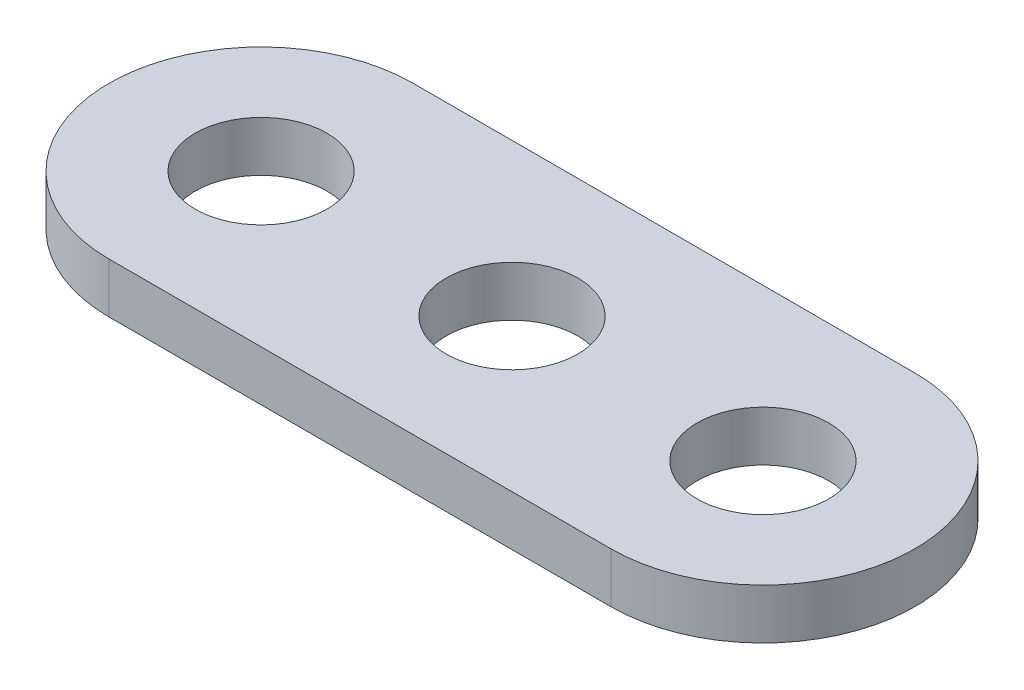
ISO-10303-21;
HEADER;
FILE_DESCRIPTION(('STEP AP214'),'2;1');
FILE_NAME('part.step','',(''),(''),'','','');
FILE_SCHEMA(('AUTOMOTIVE_DESIGN { 1 0 10303 214 1 1 1 1 }'));
ENDSEC;
DATA;
#1=APPLICATION_CONTEXT('core data for automotive mechanical design processes');
#2=APPLICATION_PROTOCOL_DEFINITION('international standard','automotive_design',2000,#1);
#3=PRODUCT_CONTEXT('',#1,'mechanical');
#4=PRODUCT('Part','Part','',(#3));
#5=PRODUCT_RELATED_PRODUCT_CATEGORY('part','',(#4));
#6=PRODUCT_DEFINITION_FORMATION('','',#4);
#7=PRODUCT_DEFINITION_CONTEXT('part definition',#1,'design');
#8=PRODUCT_DEFINITION('design','',#6,#7);
#9=PRODUCT_DEFINITION_SHAPE('','',#8);
#10=(LENGTH_UNIT() NAMED_UNIT(*) SI_UNIT(.MILLI.,.METRE.));
#11=(NAMED_UNIT(*) PLANE_ANGLE_UNIT() SI_UNIT($,.RADIAN.));
#12=(NAMED_UNIT(*) SI_UNIT($,.STERADIAN.) SOLID_ANGLE_UNIT());
#13=UNCERTAINTY_MEASURE_WITH_UNIT(LENGTH_MEASURE(1.E-05),#10,'distance_accuracy_value','');
#14=(GEOMETRIC_REPRESENTATION_CONTEXT(3) GLOBAL_UNCERTAINTY_ASSIGNED_CONTEXT((#13)) GLOBAL_UNIT_ASSIGNED_CONTEXT((#10,
#11,#12)) REPRESENTATION_CONTEXT('',''));
#15=CARTESIAN_POINT('',(0.,0.,0.));
#16=DIRECTION('',(0.,0.,1.));
#17=DIRECTION('',(1.,0.,0.));
#18=AXIS2_PLACEMENT_3D('',#15,#16,#17);
#19=CARTESIAN_POINT('',(0.,0.,0.));
#20=DIRECTION('',(0.,1.,0.));
#21=DIRECTION('',(0.,0.,1.));
#22=AXIS2_PLACEMENT_3D('',#19,#20,#21);
#23=PLANE('',#22);
#24=CARTESIAN_POINT('',(16.,0.,0.));
#25=DIRECTION('',(0.,-1.,0.));
#26=DIRECTION('',(0.,0.,-1.));
#27=AXIS2_PLACEMENT_3D('',#24,#25,#26);
#28=CIRCLE('',#27,4.85);
#29=CARTESIAN_POINT('',(16.,0.,4.85));
#30=VERTEX_POINT('',#29);
#31=CARTESIAN_POINT('',(16.,0.,-4.85));
#32=VERTEX_POINT('',#31);
#33=EDGE_CURVE('E55',#30,#32,#28,.F.);
#34=ORIENTED_EDGE('',*,*,#33,.F.);
#35=DIRECTION('',(-1.,0.,0.));
#36=VECTOR('',#35,1.);
#37=CARTESIAN_POINT('',(0.,0.,4.85));
#38=LINE('',#37,#36);
#39=CARTESIAN_POINT('',(0.,0.,4.85));
#40=VERTEX_POINT('',#39);
#41=EDGE_CURVE('E60',#30,#40,#38,.T.);
#42=ORIENTED_EDGE('',*,*,#41,.T.);
#43=CARTESIAN_POINT('',(0.,0.,0.));
#44=DIRECTION('',(0.,-1.,0.));
#45=DIRECTION('',(0.,0.,-1.));
#46=AXIS2_PLACEMENT_3D('',#43,#44,#45);
#47=CIRCLE('',#46,4.85);
#48=CARTESIAN_POINT('',(0.,0.,-4.85));
#49=VERTEX_POINT('',#48);
#50=EDGE_CURVE('E76',#49,#40,#47,.F.);
#51=ORIENTED_EDGE('',*,*,#50,.F.);
#52=DIRECTION('',(1.,0.,0.));
#53=VECTOR('',#52,1.);
#54=CARTESIAN_POINT('',(0.,0.,-4.85));
#55=LINE('',#54,#53);
#56=EDGE_CURVE('E61',#49,#32,#55,.T.);
#57=ORIENTED_EDGE('',*,*,#56,.T.);
#58=EDGE_LOOP('',(#34,#42,#51,#57));
#59=FACE_BOUND('',#58,.T.);
#60=CARTESIAN_POINT('',(0.,0.,0.));
#61=DIRECTION('',(0.,-1.,0.));
#62=DIRECTION('',(0.,0.,-1.));
#63=AXIS2_PLACEMENT_3D('',#60,#61,#62);
#64=CIRCLE('',#63,2.1);
#65=CARTESIAN_POINT('',(0.,0.,-2.1));
#66=VERTEX_POINT('',#65);
#67=EDGE_CURVE('E64',#66,#66,#64,.F.);
#68=ORIENTED_EDGE('',*,*,#67,.T.);
#69=EDGE_LOOP('',(#68));
#70=FACE_BOUND('',#69,.T.);
#71=CARTESIAN_POINT('',(8.,0.,0.));
#72=DIRECTION('',(0.,-1.,0.));
#73=DIRECTION('',(0.,0.,-1.));
#74=AXIS2_PLACEMENT_3D('',#71,#72,#73);
#75=CIRCLE('',#74,2.1);
#76=CARTESIAN_POINT('',(8.,0.,-2.1));
#77=VERTEX_POINT('',#76);
#78=EDGE_CURVE('E73',#77,#77,#75,.F.);
#79=ORIENTED_EDGE('',*,*,#78,.T.);
#80=EDGE_LOOP('',(#79));
#81=FACE_BOUND('',#80,.T.);
#82=CARTESIAN_POINT('',(16.,0.,0.));
#83=DIRECTION('',(0.,-1.,0.));
#84=DIRECTION('',(0.,0.,-1.));
#85=AXIS2_PLACEMENT_3D('',#82,#83,#84);
#86=CIRCLE('',#85,2.1);
#87=CARTESIAN_POINT('',(16.,0.,-2.1));
#88=VERTEX_POINT('',#87);
#89=EDGE_CURVE('E19',#88,#88,#86,.F.);
#90=ORIENTED_EDGE('',*,*,#89,.T.);
#91=EDGE_LOOP('',(#90));
#92=FACE_BOUND('',#91,.T.);
#93=ADVANCED_FACE('F16',(#59,#70,#81,#92),#23,.F.);
#94=CARTESIAN_POINT('',(16.,1.6,0.));
#95=DIRECTION('',(0.,-1.,0.));
#96=DIRECTION('',(0.,0.,-1.));
#97=AXIS2_PLACEMENT_3D('',#94,#95,#96);
#98=CYLINDRICAL_SURFACE('',#97,2.1);
#99=ORIENTED_EDGE('',*,*,#89,.F.);
#100=EDGE_LOOP('',(#99));
#101=FACE_BOUND('',#100,.T.);
#102=CARTESIAN_POINT('',(16.,1.6,0.));
#103=DIRECTION('',(0.,-1.,0.));
#104=DIRECTION('',(0.,0.,-1.));
#105=AXIS2_PLACEMENT_3D('',#102,#103,#104);
#106=CIRCLE('',#105,2.1);
#107=CARTESIAN_POINT('',(16.,1.6,-2.1));
#108=VERTEX_POINT('',#107);
#109=EDGE_CURVE('E94',#108,#108,#106,.T.);
#110=ORIENTED_EDGE('',*,*,#109,.F.);
#111=EDGE_LOOP('',(#110));
#112=FACE_BOUND('',#111,.T.);
#113=ADVANCED_FACE('F104',(#101,#112),#98,.F.);
#114=CARTESIAN_POINT('',(0.,1.6,0.));
#115=DIRECTION('',(0.,-1.,0.));
#116=DIRECTION('',(0.,0.,-1.));
#117=AXIS2_PLACEMENT_3D('',#114,#115,#116);
#118=CYLINDRICAL_SURFACE('',#117,2.1);
#119=ORIENTED_EDGE('',*,*,#67,.F.);
#120=EDGE_LOOP('',(#119));
#121=FACE_BOUND('',#120,.T.);
#122=CARTESIAN_POINT('',(0.,1.6,0.));
#123=DIRECTION('',(0.,-1.,0.));
#124=DIRECTION('',(0.,0.,-1.));
#125=AXIS2_PLACEMENT_3D('',#122,#123,#124);
#126=CIRCLE('',#125,2.1);
#127=CARTESIAN_POINT('',(0.,1.6,-2.1));
#128=VERTEX_POINT('',#127);
#129=EDGE_CURVE('E91',#128,#128,#126,.T.);
#130=ORIENTED_EDGE('',*,*,#129,.F.);
#131=EDGE_LOOP('',(#130));
#132=FACE_BOUND('',#131,.T.);
#133=ADVANCED_FACE('F107',(#121,#132),#118,.F.);
#134=CARTESIAN_POINT('',(16.,1.6,0.));
#135=DIRECTION('',(0.,-1.,0.));
#136=DIRECTION('',(0.,0.,-1.));
#137=AXIS2_PLACEMENT_3D('',#134,#135,#136);
#138=CYLINDRICAL_SURFACE('',#137,4.85);
#139=ORIENTED_EDGE('',*,*,#33,.T.);
#140=DIRECTION('',(0.,1.,0.));
#141=VECTOR('',#140,1.);
#142=CARTESIAN_POINT('',(16.,1.6,-4.85));
#143=LINE('',#142,#141);
#144=CARTESIAN_POINT('',(16.,1.6,-4.85));
#145=VERTEX_POINT('',#144);
#146=EDGE_CURVE('E83',#32,#145,#143,.T.);
#147=ORIENTED_EDGE('',*,*,#146,.T.);
#148=CARTESIAN_POINT('',(16.,1.6,0.));
#149=DIRECTION('',(0.,-1.,0.));
#150=DIRECTION('',(0.,0.,-1.));
#151=AXIS2_PLACEMENT_3D('',#148,#149,#150);
#152=CIRCLE('',#151,4.85);
#153=CARTESIAN_POINT('',(16.,1.6,4.85));
#154=VERTEX_POINT('',#153);
#155=EDGE_CURVE('E70',#154,#145,#152,.F.);
#156=ORIENTED_EDGE('',*,*,#155,.F.);
#157=DIRECTION('',(0.,1.,0.));
#158=VECTOR('',#157,1.);
#159=CARTESIAN_POINT('',(16.,1.6,4.85));
#160=LINE('',#159,#158);
#161=EDGE_CURVE('E67',#154,#30,#160,.F.);
#162=ORIENTED_EDGE('',*,*,#161,.T.);
#163=EDGE_LOOP('',(#139,#147,#156,#162));
#164=FACE_BOUND('',#163,.T.);
#165=ADVANCED_FACE('F68',(#164),#138,.T.);
#166=CARTESIAN_POINT('',(0.,1.6,-4.85));
#167=DIRECTION('',(0.,0.,1.));
#168=DIRECTION('',(1.,0.,0.));
#169=AXIS2_PLACEMENT_3D('',#166,#167,#168);
#170=PLANE('',#169);
#171=DIRECTION('',(1.,0.,0.));
#172=VECTOR('',#171,1.);
#173=CARTESIAN_POINT('',(0.,1.6,-4.85));
#174=LINE('',#173,#172);
#175=CARTESIAN_POINT('',(0.,1.6,-4.85));
#176=VERTEX_POINT('',#175);
#177=EDGE_CURVE('E89',#145,#176,#174,.F.);
#178=ORIENTED_EDGE('',*,*,#177,.F.);
#179=ORIENTED_EDGE('',*,*,#146,.F.);
#180=ORIENTED_EDGE('',*,*,#56,.F.);
#181=DIRECTION('',(0.,-1.,0.));
#182=VECTOR('',#181,1.);
#183=CARTESIAN_POINT('',(0.,1.6,-4.85));
#184=LINE('',#183,#182);
#185=EDGE_CURVE('E79',#176,#49,#184,.T.);
#186=ORIENTED_EDGE('',*,*,#185,.F.);
#187=EDGE_LOOP('',(#178,#179,#180,#186));
#188=FACE_BOUND('',#187,.T.);
#189=ADVANCED_FACE('F128',(#188),#170,.F.);
#190=CARTESIAN_POINT('',(0.,1.6,0.));
#191=DIRECTION('',(0.,-1.,0.));
#192=DIRECTION('',(0.,0.,-1.));
#193=AXIS2_PLACEMENT_3D('',#190,#191,#192);
#194=CYLINDRICAL_SURFACE('',#193,4.85);
#195=ORIENTED_EDGE('',*,*,#50,.T.);
#196=DIRECTION('',(0.,1.,0.));
#197=VECTOR('',#196,1.);
#198=CARTESIAN_POINT('',(0.,1.6,4.85));
#199=LINE('',#198,#197);
#200=CARTESIAN_POINT('',(0.,1.6,4.85));
#201=VERTEX_POINT('',#200);
#202=EDGE_CURVE('E34',#40,#201,#199,.T.);
#203=ORIENTED_EDGE('',*,*,#202,.T.);
#204=CARTESIAN_POINT('',(0.,1.6,0.));
#205=DIRECTION('',(0.,-1.,0.));
#206=DIRECTION('',(0.,0.,-1.));
#207=AXIS2_PLACEMENT_3D('',#204,#205,#206);
#208=CIRCLE('',#207,4.85);
#209=EDGE_CURVE('E86',#176,#201,#208,.F.);
#210=ORIENTED_EDGE('',*,*,#209,.F.);
#211=ORIENTED_EDGE('',*,*,#185,.T.);
#212=EDGE_LOOP('',(#195,#203,#210,#211));
#213=FACE_BOUND('',#212,.T.);
#214=ADVANCED_FACE('F125',(#213),#194,.T.);
#215=CARTESIAN_POINT('',(0.,1.6,4.85));
#216=DIRECTION('',(0.,0.,-1.));
#217=DIRECTION('',(-1.,0.,0.));
#218=AXIS2_PLACEMENT_3D('',#215,#216,#217);
#219=PLANE('',#218);
#220=DIRECTION('',(1.,0.,0.));
#221=VECTOR('',#220,1.);
#222=CARTESIAN_POINT('',(0.,1.6,4.85));
#223=LINE('',#222,#221);
#224=EDGE_CURVE('E25',#201,#154,#223,.T.);
#225=ORIENTED_EDGE('',*,*,#224,.F.);
#226=ORIENTED_EDGE('',*,*,#202,.F.);
#227=ORIENTED_EDGE('',*,*,#41,.F.);
#228=ORIENTED_EDGE('',*,*,#161,.F.);
#229=EDGE_LOOP('',(#225,#226,#227,#228));
#230=FACE_BOUND('',#229,.T.);
#231=ADVANCED_FACE('F75',(#230),#219,.F.);
#232=CARTESIAN_POINT('',(8.,1.6,0.));
#233=DIRECTION('',(0.,-1.,0.));
#234=DIRECTION('',(0.,0.,-1.));
#235=AXIS2_PLACEMENT_3D('',#232,#233,#234);
#236=CYLINDRICAL_SURFACE('',#235,2.1);
#237=ORIENTED_EDGE('',*,*,#78,.F.);
#238=EDGE_LOOP('',(#237));
#239=FACE_BOUND('',#238,.T.);
#240=CARTESIAN_POINT('',(8.,1.6,0.));
#241=DIRECTION('',(0.,-1.,0.));
#242=DIRECTION('',(0.,0.,-1.));
#243=AXIS2_PLACEMENT_3D('',#240,#241,#242);
#244=CIRCLE('',#243,2.1);
#245=CARTESIAN_POINT('',(8.,1.6,-2.1));
#246=VERTEX_POINT('',#245);
#247=EDGE_CURVE('E9',#246,#246,#244,.T.);
#248=ORIENTED_EDGE('',*,*,#247,.F.);
#249=EDGE_LOOP('',(#248));
#250=FACE_BOUND('',#249,.T.);
#251=ADVANCED_FACE('F112',(#239,#250),#236,.F.);
#252=CARTESIAN_POINT('',(0.,1.6,0.));
#253=DIRECTION('',(0.,1.,0.));
#254=DIRECTION('',(0.,0.,1.));
#255=AXIS2_PLACEMENT_3D('',#252,#253,#254);
#256=PLANE('',#255);
#257=ORIENTED_EDGE('',*,*,#247,.T.);
#258=EDGE_LOOP('',(#257));
#259=FACE_BOUND('',#258,.T.);
#260=ORIENTED_EDGE('',*,*,#209,.T.);
#261=ORIENTED_EDGE('',*,*,#224,.T.);
#262=ORIENTED_EDGE('',*,*,#155,.T.);
#263=ORIENTED_EDGE('',*,*,#177,.T.);
#264=EDGE_LOOP('',(#260,#261,#262,#263));
#265=FACE_BOUND('',#264,.T.);
#266=ORIENTED_EDGE('',*,*,#129,.T.);
#267=EDGE_LOOP('',(#266));
#268=FACE_BOUND('',#267,.T.);
#269=ORIENTED_EDGE('',*,*,#109,.T.);
#270=EDGE_LOOP('',(#269));
#271=FACE_BOUND('',#270,.T.);
#272=ADVANCED_FACE('F110',(#259,#265,#268,#271),#256,.T.);
#273=CLOSED_SHELL('',(#93,#113,#133,#165,#189,#214,#231,#251,#272));
#274=MANIFOLD_SOLID_BREP('B1',#273);
#275=ADVANCED_BREP_SHAPE_REPRESENTATION('',(#18,#274),#14);
#276=SHAPE_DEFINITION_REPRESENTATION(#9,#275);
ENDSEC;
END-ISO-10303-21;
